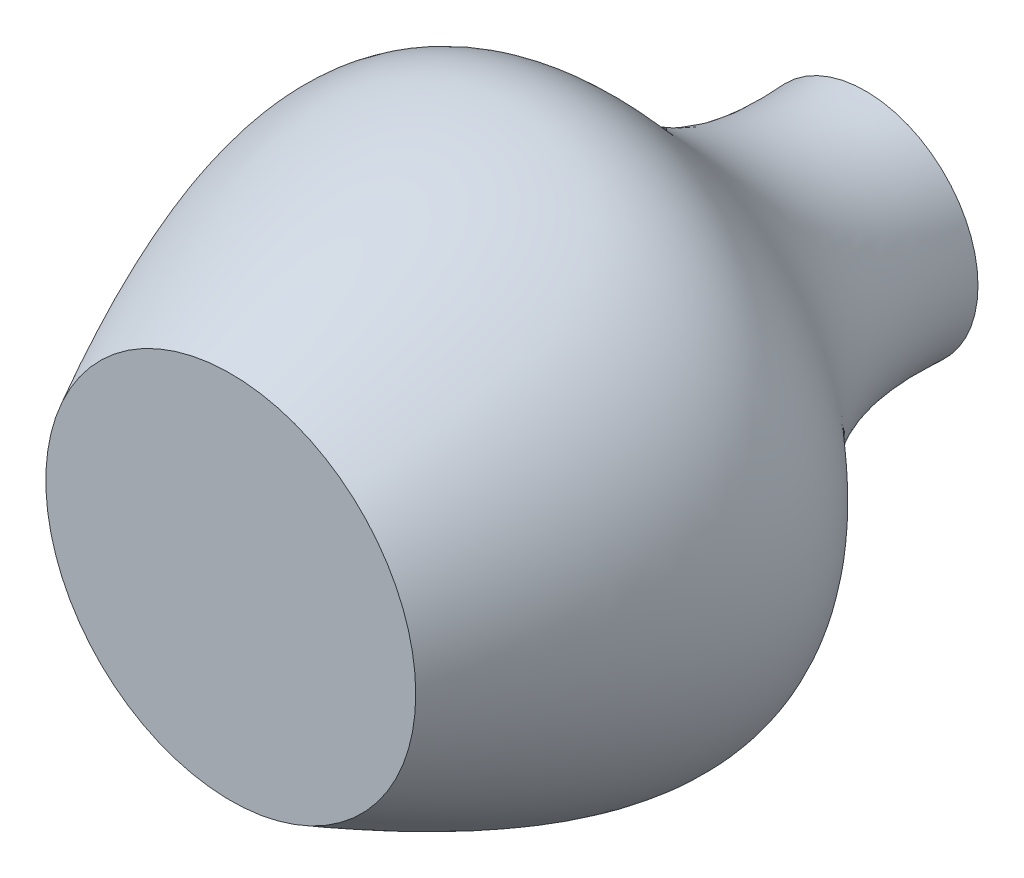
ISO-10303-21;
HEADER;
FILE_DESCRIPTION(('STEP AP214'),'2;1');
FILE_NAME('part.step','',(''),(''),'','','');
FILE_SCHEMA(('AUTOMOTIVE_DESIGN { 1 0 10303 214 1 1 1 1 }'));
ENDSEC;
DATA;
#1=APPLICATION_CONTEXT('core data for automotive mechanical design processes');
#2=APPLICATION_PROTOCOL_DEFINITION('international standard','automotive_design',2000,#1);
#3=PRODUCT_CONTEXT('',#1,'mechanical');
#4=PRODUCT('Part','Part','',(#3));
#5=PRODUCT_RELATED_PRODUCT_CATEGORY('part','',(#4));
#6=PRODUCT_DEFINITION_FORMATION('','',#4);
#7=PRODUCT_DEFINITION_CONTEXT('part definition',#1,'design');
#8=PRODUCT_DEFINITION('design','',#6,#7);
#9=PRODUCT_DEFINITION_SHAPE('','',#8);
#10=(LENGTH_UNIT() NAMED_UNIT(*) SI_UNIT(.MILLI.,.METRE.));
#11=(NAMED_UNIT(*) PLANE_ANGLE_UNIT() SI_UNIT($,.RADIAN.));
#12=(NAMED_UNIT(*) SI_UNIT($,.STERADIAN.) SOLID_ANGLE_UNIT());
#13=UNCERTAINTY_MEASURE_WITH_UNIT(LENGTH_MEASURE(1.E-05),#10,'distance_accuracy_value','');
#14=(GEOMETRIC_REPRESENTATION_CONTEXT(3) GLOBAL_UNCERTAINTY_ASSIGNED_CONTEXT((#13)) GLOBAL_UNIT_ASSIGNED_CONTEXT((#10,
#11,#12)) REPRESENTATION_CONTEXT('',''));
#15=CARTESIAN_POINT('',(0.,0.,0.));
#16=DIRECTION('',(0.,0.,1.));
#17=DIRECTION('',(1.,0.,0.));
#18=AXIS2_PLACEMENT_3D('',#15,#16,#17);
#19=CARTESIAN_POINT('',(0.,0.,0.));
#20=DIRECTION('',(0.,0.,-1.));
#21=DIRECTION('',(-1.,0.,0.));
#22=AXIS2_PLACEMENT_3D('',#19,#20,#21);
#23=PLANE('',#22);
#24=CARTESIAN_POINT('',(0.,0.,0.));
#25=DIRECTION('',(0.,0.,1.));
#26=DIRECTION('',(1.,0.,0.));
#27=AXIS2_PLACEMENT_3D('',#24,#25,#26);
#28=CIRCLE('',#27,20.);
#29=CARTESIAN_POINT('',(20.,0.,0.));
#30=VERTEX_POINT('',#29);
#31=EDGE_CURVE('E54',#30,#30,#28,.T.);
#32=ORIENTED_EDGE('',*,*,#31,.T.);
#33=EDGE_LOOP('',(#32));
#34=FACE_BOUND('',#33,.T.);
#35=ADVANCED_FACE('F47',(#34),#23,.F.);
#36=CARTESIAN_POINT('',(0.,0.,-68.6301741424558));
#37=DIRECTION('',(0.,0.,1.));
#38=DIRECTION('',(1.,0.,0.));
#39=AXIS2_PLACEMENT_3D('',#36,#37,#38);
#40=PLANE('',#39);
#41=CARTESIAN_POINT('',(0.,0.,-68.6301741424558));
#42=DIRECTION('',(0.,0.,1.));
#43=DIRECTION('',(1.,0.,0.));
#44=AXIS2_PLACEMENT_3D('',#41,#42,#43);
#45=CIRCLE('',#44,12.160785242786);
#46=CARTESIAN_POINT('',(12.160785242786,0.,-68.6301741424558));
#47=VERTEX_POINT('',#46);
#48=EDGE_CURVE('E10',#47,#47,#45,.T.);
#49=ORIENTED_EDGE('',*,*,#48,.F.);
#50=EDGE_LOOP('',(#49));
#51=FACE_BOUND('',#50,.T.);
#52=ADVANCED_FACE('F73',(#51),#40,.F.);
#53=CARTESIAN_POINT('',(-12.160785242786,0.,-68.6301741424558));
#54=CARTESIAN_POINT('',(-10.,0.,-32.9906451140928));
#55=CARTESIAN_POINT('',(-48.2819295282891,0.,-52.9776782854045));
#56=CARTESIAN_POINT('',(-20.,0.,0.));
#57=B_SPLINE_CURVE_WITH_KNOTS('',3,(#53,#54,#55,#56),.UNSPECIFIED.,.F.,.F.,(4,4),(0.,1.),.UNSPECIFIED.);
#58=CARTESIAN_POINT('',(0.,0.,0.));
#59=DIRECTION('',(0.,0.,1.));
#60=AXIS1_PLACEMENT('',#58,#59);
#61=SURFACE_OF_REVOLUTION('',#57,#60);
#62=ORIENTED_EDGE('',*,*,#31,.F.);
#63=EDGE_LOOP('',(#62));
#64=FACE_BOUND('',#63,.T.);
#65=ORIENTED_EDGE('',*,*,#48,.T.);
#66=EDGE_LOOP('',(#65));
#67=FACE_BOUND('',#66,.T.);
#68=ADVANCED_FACE('F71',(#64,#67),#61,.T.);
#69=CLOSED_SHELL('',(#35,#52,#68));
#70=MANIFOLD_SOLID_BREP('B2',#69);
#71=ADVANCED_BREP_SHAPE_REPRESENTATION('',(#18,#70),#14);
#72=SHAPE_DEFINITION_REPRESENTATION(#9,#71);
ENDSEC;
END-ISO-10303-21;
